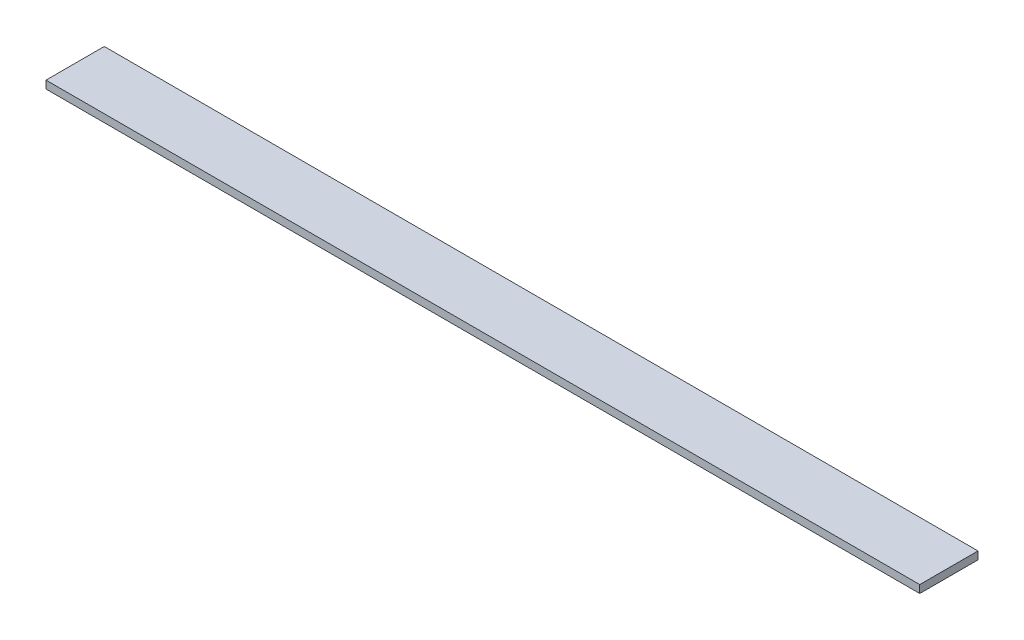
ISO-10303-21;
HEADER;
FILE_DESCRIPTION(('STEP AP214'),'2;1');
FILE_NAME('part.step','',(''),(''),'','','');
FILE_SCHEMA(('AUTOMOTIVE_DESIGN { 1 0 10303 214 1 1 1 1 }'));
ENDSEC;
DATA;
#1=APPLICATION_CONTEXT('core data for automotive mechanical design processes');
#2=APPLICATION_PROTOCOL_DEFINITION('international standard','automotive_design',2000,#1);
#3=PRODUCT_CONTEXT('',#1,'mechanical');
#4=PRODUCT('Part','Part','',(#3));
#5=PRODUCT_RELATED_PRODUCT_CATEGORY('part','',(#4));
#6=PRODUCT_DEFINITION_FORMATION('','',#4);
#7=PRODUCT_DEFINITION_CONTEXT('part definition',#1,'design');
#8=PRODUCT_DEFINITION('design','',#6,#7);
#9=PRODUCT_DEFINITION_SHAPE('','',#8);
#10=(LENGTH_UNIT() NAMED_UNIT(*) SI_UNIT(.MILLI.,.METRE.));
#11=(NAMED_UNIT(*) PLANE_ANGLE_UNIT() SI_UNIT($,.RADIAN.));
#12=(NAMED_UNIT(*) SI_UNIT($,.STERADIAN.) SOLID_ANGLE_UNIT());
#13=UNCERTAINTY_MEASURE_WITH_UNIT(LENGTH_MEASURE(1.E-05),#10,'distance_accuracy_value','');
#14=(GEOMETRIC_REPRESENTATION_CONTEXT(3) GLOBAL_UNCERTAINTY_ASSIGNED_CONTEXT((#13)) GLOBAL_UNIT_ASSIGNED_CONTEXT((#10,
#11,#12)) REPRESENTATION_CONTEXT('',''));
#15=CARTESIAN_POINT('',(0.,0.,0.));
#16=DIRECTION('',(0.,0.,1.));
#17=DIRECTION('',(1.,0.,0.));
#18=AXIS2_PLACEMENT_3D('',#15,#16,#17);
#19=CARTESIAN_POINT('',(225.,4.,15.));
#20=DIRECTION('',(-1.,0.,0.));
#21=DIRECTION('',(0.,0.,1.));
#22=AXIS2_PLACEMENT_3D('',#19,#20,#21);
#23=PLANE('',#22);
#24=DIRECTION('',(0.,0.,-1.));
#25=VECTOR('',#24,1.);
#26=CARTESIAN_POINT('',(225.,0.,15.));
#27=LINE('',#26,#25);
#28=CARTESIAN_POINT('',(225.,0.,15.));
#29=VERTEX_POINT('',#28);
#30=CARTESIAN_POINT('',(225.,0.,-15.));
#31=VERTEX_POINT('',#30);
#32=EDGE_CURVE('E80',#29,#31,#27,.T.);
#33=ORIENTED_EDGE('',*,*,#32,.T.);
#34=DIRECTION('',(0.,-1.,0.));
#35=VECTOR('',#34,1.);
#36=CARTESIAN_POINT('',(225.,4.,-15.));
#37=LINE('',#36,#35);
#38=CARTESIAN_POINT('',(225.,4.,-15.));
#39=VERTEX_POINT('',#38);
#40=EDGE_CURVE('E11',#39,#31,#37,.T.);
#41=ORIENTED_EDGE('',*,*,#40,.F.);
#42=DIRECTION('',(0.,0.,-1.));
#43=VECTOR('',#42,1.);
#44=CARTESIAN_POINT('',(225.,4.,15.));
#45=LINE('',#44,#43);
#46=CARTESIAN_POINT('',(225.,4.,15.));
#47=VERTEX_POINT('',#46);
#48=EDGE_CURVE('E68',#47,#39,#45,.T.);
#49=ORIENTED_EDGE('',*,*,#48,.F.);
#50=DIRECTION('',(0.,-1.,0.));
#51=VECTOR('',#50,1.);
#52=CARTESIAN_POINT('',(225.,4.,15.));
#53=LINE('',#52,#51);
#54=EDGE_CURVE('E76',#47,#29,#53,.T.);
#55=ORIENTED_EDGE('',*,*,#54,.T.);
#56=EDGE_LOOP('',(#33,#41,#49,#55));
#57=FACE_BOUND('',#56,.T.);
#58=ADVANCED_FACE('F17',(#57),#23,.F.);
#59=CARTESIAN_POINT('',(-225.,4.,-15.));
#60=DIRECTION('',(0.,0.,1.));
#61=DIRECTION('',(1.,0.,0.));
#62=AXIS2_PLACEMENT_3D('',#59,#60,#61);
#63=PLANE('',#62);
#64=DIRECTION('',(-1.,0.,0.));
#65=VECTOR('',#64,1.);
#66=CARTESIAN_POINT('',(-225.,0.,-15.));
#67=LINE('',#66,#65);
#68=CARTESIAN_POINT('',(-225.,0.,-15.));
#69=VERTEX_POINT('',#68);
#70=EDGE_CURVE('E72',#31,#69,#67,.T.);
#71=ORIENTED_EDGE('',*,*,#70,.T.);
#72=DIRECTION('',(0.,-1.,0.));
#73=VECTOR('',#72,1.);
#74=CARTESIAN_POINT('',(-225.,4.,-15.));
#75=LINE('',#74,#73);
#76=CARTESIAN_POINT('',(-225.,4.,-15.));
#77=VERTEX_POINT('',#76);
#78=EDGE_CURVE('E25',#77,#69,#75,.T.);
#79=ORIENTED_EDGE('',*,*,#78,.F.);
#80=DIRECTION('',(-1.,0.,0.));
#81=VECTOR('',#80,1.);
#82=CARTESIAN_POINT('',(-225.,4.,-15.));
#83=LINE('',#82,#81);
#84=EDGE_CURVE('E63',#39,#77,#83,.T.);
#85=ORIENTED_EDGE('',*,*,#84,.F.);
#86=ORIENTED_EDGE('',*,*,#40,.T.);
#87=EDGE_LOOP('',(#71,#79,#85,#86));
#88=FACE_BOUND('',#87,.T.);
#89=ADVANCED_FACE('F71',(#88),#63,.F.);
#90=CARTESIAN_POINT('',(-225.,4.,15.));
#91=DIRECTION('',(1.,0.,0.));
#92=DIRECTION('',(0.,0.,-1.));
#93=AXIS2_PLACEMENT_3D('',#90,#91,#92);
#94=PLANE('',#93);
#95=DIRECTION('',(0.,0.,1.));
#96=VECTOR('',#95,1.);
#97=CARTESIAN_POINT('',(-225.,0.,15.));
#98=LINE('',#97,#96);
#99=CARTESIAN_POINT('',(-225.,0.,15.));
#100=VERTEX_POINT('',#99);
#101=EDGE_CURVE('E50',#69,#100,#98,.T.);
#102=ORIENTED_EDGE('',*,*,#101,.T.);
#103=DIRECTION('',(0.,-1.,0.));
#104=VECTOR('',#103,1.);
#105=CARTESIAN_POINT('',(-225.,4.,15.));
#106=LINE('',#105,#104);
#107=CARTESIAN_POINT('',(-225.,4.,15.));
#108=VERTEX_POINT('',#107);
#109=EDGE_CURVE('E73',#108,#100,#106,.T.);
#110=ORIENTED_EDGE('',*,*,#109,.F.);
#111=DIRECTION('',(0.,0.,1.));
#112=VECTOR('',#111,1.);
#113=CARTESIAN_POINT('',(-225.,4.,15.));
#114=LINE('',#113,#112);
#115=EDGE_CURVE('E66',#77,#108,#114,.T.);
#116=ORIENTED_EDGE('',*,*,#115,.F.);
#117=ORIENTED_EDGE('',*,*,#78,.T.);
#118=EDGE_LOOP('',(#102,#110,#116,#117));
#119=FACE_BOUND('',#118,.T.);
#120=ADVANCED_FACE('F74',(#119),#94,.F.);
#121=CARTESIAN_POINT('',(-225.,4.,15.));
#122=DIRECTION('',(0.,0.,-1.));
#123=DIRECTION('',(-1.,0.,0.));
#124=AXIS2_PLACEMENT_3D('',#121,#122,#123);
#125=PLANE('',#124);
#126=DIRECTION('',(1.,0.,0.));
#127=VECTOR('',#126,1.);
#128=CARTESIAN_POINT('',(-225.,0.,15.));
#129=LINE('',#128,#127);
#130=EDGE_CURVE('E56',#100,#29,#129,.T.);
#131=ORIENTED_EDGE('',*,*,#130,.T.);
#132=ORIENTED_EDGE('',*,*,#54,.F.);
#133=DIRECTION('',(1.,0.,0.));
#134=VECTOR('',#133,1.);
#135=CARTESIAN_POINT('',(-225.,4.,15.));
#136=LINE('',#135,#134);
#137=EDGE_CURVE('E33',#108,#47,#136,.T.);
#138=ORIENTED_EDGE('',*,*,#137,.F.);
#139=ORIENTED_EDGE('',*,*,#109,.T.);
#140=EDGE_LOOP('',(#131,#132,#138,#139));
#141=FACE_BOUND('',#140,.T.);
#142=ADVANCED_FACE('F87',(#141),#125,.F.);
#143=CARTESIAN_POINT('',(0.,4.,0.));
#144=DIRECTION('',(0.,-1.,0.));
#145=DIRECTION('',(0.,0.,-1.));
#146=AXIS2_PLACEMENT_3D('',#143,#144,#145);
#147=PLANE('',#146);
#148=ORIENTED_EDGE('',*,*,#48,.T.);
#149=ORIENTED_EDGE('',*,*,#84,.T.);
#150=ORIENTED_EDGE('',*,*,#115,.T.);
#151=ORIENTED_EDGE('',*,*,#137,.T.);
#152=EDGE_LOOP('',(#148,#149,#150,#151));
#153=FACE_BOUND('',#152,.T.);
#154=ADVANCED_FACE('F64',(#153),#147,.F.);
#155=CARTESIAN_POINT('',(0.,0.,0.));
#156=DIRECTION('',(0.,-1.,0.));
#157=DIRECTION('',(0.,0.,-1.));
#158=AXIS2_PLACEMENT_3D('',#155,#156,#157);
#159=PLANE('',#158);
#160=ORIENTED_EDGE('',*,*,#32,.F.);
#161=ORIENTED_EDGE('',*,*,#130,.F.);
#162=ORIENTED_EDGE('',*,*,#101,.F.);
#163=ORIENTED_EDGE('',*,*,#70,.F.);
#164=EDGE_LOOP('',(#160,#161,#162,#163));
#165=FACE_BOUND('',#164,.T.);
#166=ADVANCED_FACE('F90',(#165),#159,.T.);
#167=CLOSED_SHELL('',(#58,#89,#120,#142,#154,#166));
#168=MANIFOLD_SOLID_BREP('B1',#167);
#169=ADVANCED_BREP_SHAPE_REPRESENTATION('',(#18,#168),#14);
#170=SHAPE_DEFINITION_REPRESENTATION(#9,#169);
ENDSEC;
END-ISO-10303-21;
